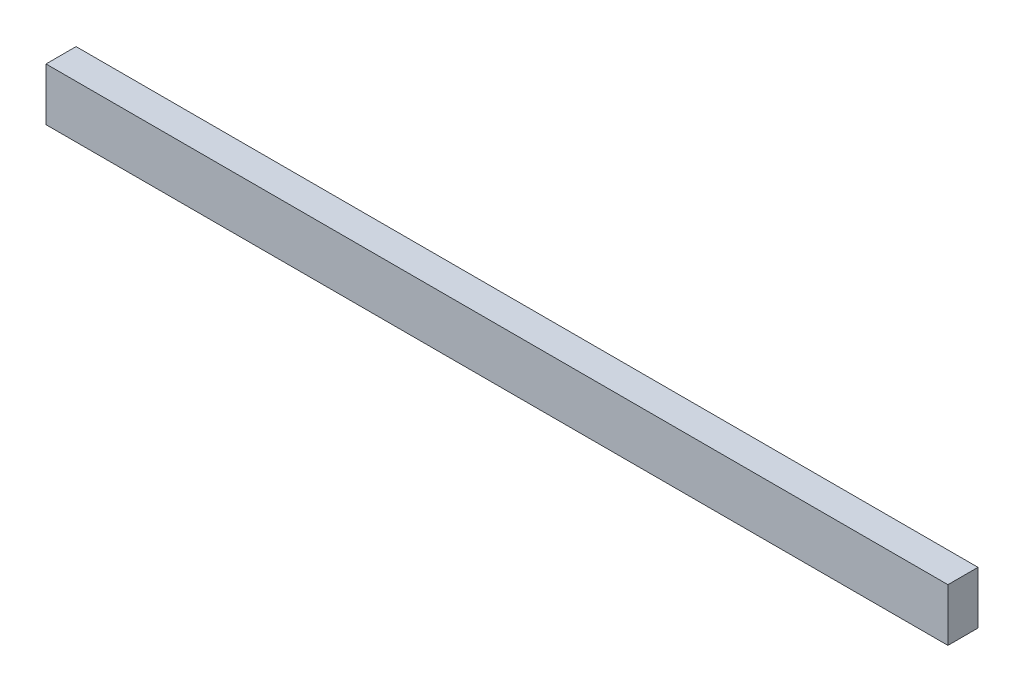
ISO-10303-21;
HEADER;
FILE_DESCRIPTION(('STEP AP214'),'2;1');
FILE_NAME('part.step','',(''),(''),'','','');
FILE_SCHEMA(('AUTOMOTIVE_DESIGN { 1 0 10303 214 1 1 1 1 }'));
ENDSEC;
DATA;
#1=APPLICATION_CONTEXT('core data for automotive mechanical design processes');
#2=APPLICATION_PROTOCOL_DEFINITION('international standard','automotive_design',2000,#1);
#3=PRODUCT_CONTEXT('',#1,'mechanical');
#4=PRODUCT('Part','Part','',(#3));
#5=PRODUCT_RELATED_PRODUCT_CATEGORY('part','',(#4));
#6=PRODUCT_DEFINITION_FORMATION('','',#4);
#7=PRODUCT_DEFINITION_CONTEXT('part definition',#1,'design');
#8=PRODUCT_DEFINITION('design','',#6,#7);
#9=PRODUCT_DEFINITION_SHAPE('','',#8);
#10=(LENGTH_UNIT() NAMED_UNIT(*) SI_UNIT(.MILLI.,.METRE.));
#11=(NAMED_UNIT(*) PLANE_ANGLE_UNIT() SI_UNIT($,.RADIAN.));
#12=(NAMED_UNIT(*) SI_UNIT($,.STERADIAN.) SOLID_ANGLE_UNIT());
#13=UNCERTAINTY_MEASURE_WITH_UNIT(LENGTH_MEASURE(1.E-05),#10,'distance_accuracy_value','');
#14=(GEOMETRIC_REPRESENTATION_CONTEXT(3) GLOBAL_UNCERTAINTY_ASSIGNED_CONTEXT((#13)) GLOBAL_UNIT_ASSIGNED_CONTEXT((#10,
#11,#12)) REPRESENTATION_CONTEXT('',''));
#15=CARTESIAN_POINT('',(0.,0.,0.));
#16=DIRECTION('',(0.,0.,1.));
#17=DIRECTION('',(1.,0.,0.));
#18=AXIS2_PLACEMENT_3D('',#15,#16,#17);
#19=CARTESIAN_POINT('',(-255.954852369178,102.602241964641,10.16));
#20=DIRECTION('',(1.,0.,0.));
#21=DIRECTION('',(0.,0.,-1.));
#22=AXIS2_PLACEMENT_3D('',#19,#20,#21);
#23=PLANE('',#22);
#24=DIRECTION('',(0.,-1.,0.));
#25=VECTOR('',#24,1.);
#26=CARTESIAN_POINT('',(-255.954852369178,102.602241964641,0.));
#27=LINE('',#26,#25);
#28=CARTESIAN_POINT('',(-255.954852369178,102.602241964641,0.));
#29=VERTEX_POINT('',#28);
#30=CARTESIAN_POINT('',(-255.954852369178,84.8222419646411,0.));
#31=VERTEX_POINT('',#30);
#32=EDGE_CURVE('E95',#29,#31,#27,.T.);
#33=ORIENTED_EDGE('',*,*,#32,.T.);
#34=DIRECTION('',(0.,0.,-1.));
#35=VECTOR('',#34,1.);
#36=CARTESIAN_POINT('',(-255.954852369178,84.8222419646411,10.16));
#37=LINE('',#36,#35);
#38=CARTESIAN_POINT('',(-255.954852369178,84.8222419646411,10.16));
#39=VERTEX_POINT('',#38);
#40=EDGE_CURVE('E11',#39,#31,#37,.T.);
#41=ORIENTED_EDGE('',*,*,#40,.F.);
#42=DIRECTION('',(0.,-1.,0.));
#43=VECTOR('',#42,1.);
#44=CARTESIAN_POINT('',(-255.954852369178,102.602241964641,10.16));
#45=LINE('',#44,#43);
#46=CARTESIAN_POINT('',(-255.954852369178,102.602241964641,10.16));
#47=VERTEX_POINT('',#46);
#48=EDGE_CURVE('E83',#47,#39,#45,.T.);
#49=ORIENTED_EDGE('',*,*,#48,.F.);
#50=DIRECTION('',(0.,0.,-1.));
#51=VECTOR('',#50,1.);
#52=CARTESIAN_POINT('',(-255.954852369178,102.602241964641,10.16));
#53=LINE('',#52,#51);
#54=EDGE_CURVE('E91',#47,#29,#53,.T.);
#55=ORIENTED_EDGE('',*,*,#54,.T.);
#56=EDGE_LOOP('',(#33,#41,#49,#55));
#57=FACE_BOUND('',#56,.T.);
#58=ADVANCED_FACE('F32',(#57),#23,.F.);
#59=CARTESIAN_POINT('',(-255.954852369178,84.8222419646411,10.16));
#60=DIRECTION('',(0.,1.,0.));
#61=DIRECTION('',(0.,0.,1.));
#62=AXIS2_PLACEMENT_3D('',#59,#60,#61);
#63=PLANE('',#62);
#64=DIRECTION('',(1.,0.,0.));
#65=VECTOR('',#64,1.);
#66=CARTESIAN_POINT('',(-255.954852369178,84.8222419646411,0.));
#67=LINE('',#66,#65);
#68=CARTESIAN_POINT('',(48.845147630822,84.8222419646411,0.));
#69=VERTEX_POINT('',#68);
#70=EDGE_CURVE('E87',#31,#69,#67,.T.);
#71=ORIENTED_EDGE('',*,*,#70,.T.);
#72=DIRECTION('',(0.,0.,-1.));
#73=VECTOR('',#72,1.);
#74=CARTESIAN_POINT('',(48.845147630822,84.8222419646411,10.16));
#75=LINE('',#74,#73);
#76=CARTESIAN_POINT('',(48.845147630822,84.8222419646411,10.16));
#77=VERTEX_POINT('',#76);
#78=EDGE_CURVE('E40',#77,#69,#75,.T.);
#79=ORIENTED_EDGE('',*,*,#78,.F.);
#80=DIRECTION('',(1.,0.,0.));
#81=VECTOR('',#80,1.);
#82=CARTESIAN_POINT('',(-255.954852369178,84.8222419646411,10.16));
#83=LINE('',#82,#81);
#84=EDGE_CURVE('E78',#39,#77,#83,.T.);
#85=ORIENTED_EDGE('',*,*,#84,.F.);
#86=ORIENTED_EDGE('',*,*,#40,.T.);
#87=EDGE_LOOP('',(#71,#79,#85,#86));
#88=FACE_BOUND('',#87,.T.);
#89=ADVANCED_FACE('F86',(#88),#63,.F.);
#90=CARTESIAN_POINT('',(48.845147630822,102.602241964641,10.16));
#91=DIRECTION('',(-1.,0.,0.));
#92=DIRECTION('',(0.,0.,1.));
#93=AXIS2_PLACEMENT_3D('',#90,#91,#92);
#94=PLANE('',#93);
#95=DIRECTION('',(0.,1.,0.));
#96=VECTOR('',#95,1.);
#97=CARTESIAN_POINT('',(48.845147630822,102.602241964641,0.));
#98=LINE('',#97,#96);
#99=CARTESIAN_POINT('',(48.845147630822,102.602241964641,0.));
#100=VERTEX_POINT('',#99);
#101=EDGE_CURVE('E65',#69,#100,#98,.T.);
#102=ORIENTED_EDGE('',*,*,#101,.T.);
#103=DIRECTION('',(0.,0.,-1.));
#104=VECTOR('',#103,1.);
#105=CARTESIAN_POINT('',(48.845147630822,102.602241964641,10.16));
#106=LINE('',#105,#104);
#107=CARTESIAN_POINT('',(48.845147630822,102.602241964641,10.16));
#108=VERTEX_POINT('',#107);
#109=EDGE_CURVE('E88',#108,#100,#106,.T.);
#110=ORIENTED_EDGE('',*,*,#109,.F.);
#111=DIRECTION('',(0.,1.,0.));
#112=VECTOR('',#111,1.);
#113=CARTESIAN_POINT('',(48.845147630822,102.602241964641,10.16));
#114=LINE('',#113,#112);
#115=EDGE_CURVE('E81',#77,#108,#114,.T.);
#116=ORIENTED_EDGE('',*,*,#115,.F.);
#117=ORIENTED_EDGE('',*,*,#78,.T.);
#118=EDGE_LOOP('',(#102,#110,#116,#117));
#119=FACE_BOUND('',#118,.T.);
#120=ADVANCED_FACE('F89',(#119),#94,.F.);
#121=CARTESIAN_POINT('',(-255.954852369178,102.602241964641,10.16));
#122=DIRECTION('',(0.,-1.,0.));
#123=DIRECTION('',(0.,0.,-1.));
#124=AXIS2_PLACEMENT_3D('',#121,#122,#123);
#125=PLANE('',#124);
#126=DIRECTION('',(-1.,0.,0.));
#127=VECTOR('',#126,1.);
#128=CARTESIAN_POINT('',(-255.954852369178,102.602241964641,0.));
#129=LINE('',#128,#127);
#130=EDGE_CURVE('E71',#100,#29,#129,.T.);
#131=ORIENTED_EDGE('',*,*,#130,.T.);
#132=ORIENTED_EDGE('',*,*,#54,.F.);
#133=DIRECTION('',(-1.,0.,0.));
#134=VECTOR('',#133,1.);
#135=CARTESIAN_POINT('',(-255.954852369178,102.602241964641,10.16));
#136=LINE('',#135,#134);
#137=EDGE_CURVE('E48',#108,#47,#136,.T.);
#138=ORIENTED_EDGE('',*,*,#137,.F.);
#139=ORIENTED_EDGE('',*,*,#109,.T.);
#140=EDGE_LOOP('',(#131,#132,#138,#139));
#141=FACE_BOUND('',#140,.T.);
#142=ADVANCED_FACE('F102',(#141),#125,.F.);
#143=CARTESIAN_POINT('',(0.,0.,10.16));
#144=DIRECTION('',(0.,0.,1.));
#145=DIRECTION('',(1.,0.,0.));
#146=AXIS2_PLACEMENT_3D('',#143,#144,#145);
#147=PLANE('',#146);
#148=ORIENTED_EDGE('',*,*,#48,.T.);
#149=ORIENTED_EDGE('',*,*,#84,.T.);
#150=ORIENTED_EDGE('',*,*,#115,.T.);
#151=ORIENTED_EDGE('',*,*,#137,.T.);
#152=EDGE_LOOP('',(#148,#149,#150,#151));
#153=FACE_BOUND('',#152,.T.);
#154=ADVANCED_FACE('F79',(#153),#147,.T.);
#155=CARTESIAN_POINT('',(0.,0.,0.));
#156=DIRECTION('',(0.,0.,1.));
#157=DIRECTION('',(1.,0.,0.));
#158=AXIS2_PLACEMENT_3D('',#155,#156,#157);
#159=PLANE('',#158);
#160=ORIENTED_EDGE('',*,*,#32,.F.);
#161=ORIENTED_EDGE('',*,*,#130,.F.);
#162=ORIENTED_EDGE('',*,*,#101,.F.);
#163=ORIENTED_EDGE('',*,*,#70,.F.);
#164=EDGE_LOOP('',(#160,#161,#162,#163));
#165=FACE_BOUND('',#164,.T.);
#166=ADVANCED_FACE('F105',(#165),#159,.F.);
#167=CLOSED_SHELL('',(#58,#89,#120,#142,#154,#166));
#168=MANIFOLD_SOLID_BREP('B2',#167);
#169=ADVANCED_BREP_SHAPE_REPRESENTATION('',(#18,#168),#14);
#170=SHAPE_DEFINITION_REPRESENTATION(#9,#169);
ENDSEC;
END-ISO-10303-21;
